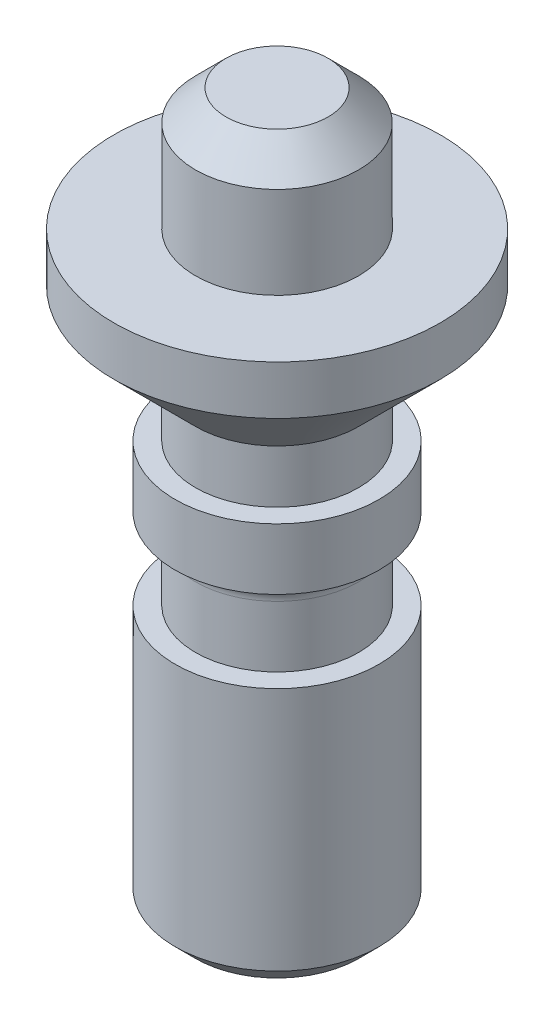
ISO-10303-21;
HEADER;
FILE_DESCRIPTION(('STEP AP214'),'2;1');
FILE_NAME('part.step','',(''),(''),'','','');
FILE_SCHEMA(('AUTOMOTIVE_DESIGN { 1 0 10303 214 1 1 1 1 }'));
ENDSEC;
DATA;
#1=APPLICATION_CONTEXT('core data for automotive mechanical design processes');
#2=APPLICATION_PROTOCOL_DEFINITION('international standard','automotive_design',2000,#1);
#3=PRODUCT_CONTEXT('',#1,'mechanical');
#4=PRODUCT('Part','Part','',(#3));
#5=PRODUCT_RELATED_PRODUCT_CATEGORY('part','',(#4));
#6=PRODUCT_DEFINITION_FORMATION('','',#4);
#7=PRODUCT_DEFINITION_CONTEXT('part definition',#1,'design');
#8=PRODUCT_DEFINITION('design','',#6,#7);
#9=PRODUCT_DEFINITION_SHAPE('','',#8);
#10=(LENGTH_UNIT() NAMED_UNIT(*) SI_UNIT(.MILLI.,.METRE.));
#11=(NAMED_UNIT(*) PLANE_ANGLE_UNIT() SI_UNIT($,.RADIAN.));
#12=(NAMED_UNIT(*) SI_UNIT($,.STERADIAN.) SOLID_ANGLE_UNIT());
#13=UNCERTAINTY_MEASURE_WITH_UNIT(LENGTH_MEASURE(1.E-05),#10,'distance_accuracy_value','');
#14=(GEOMETRIC_REPRESENTATION_CONTEXT(3) GLOBAL_UNCERTAINTY_ASSIGNED_CONTEXT((#13)) GLOBAL_UNIT_ASSIGNED_CONTEXT((#10,
#11,#12)) REPRESENTATION_CONTEXT('',''));
#15=CARTESIAN_POINT('',(0.,0.,0.));
#16=DIRECTION('',(0.,0.,1.));
#17=DIRECTION('',(1.,0.,0.));
#18=AXIS2_PLACEMENT_3D('',#15,#16,#17);
#19=CARTESIAN_POINT('',(0.,8.5,0.));
#20=DIRECTION('',(0.,-1.,0.));
#21=DIRECTION('',(1.,0.,0.));
#22=AXIS2_PLACEMENT_3D('',#19,#20,#21);
#23=CYLINDRICAL_SURFACE('',#22,1.5);
#24=CARTESIAN_POINT('',(0.,0.,0.));
#25=DIRECTION('',(0.,-1.,0.));
#26=DIRECTION('',(1.,0.,0.));
#27=AXIS2_PLACEMENT_3D('',#24,#25,#26);
#28=CIRCLE('',#27,1.5);
#29=CARTESIAN_POINT('',(-0.5,0.,1.4142135623731));
#30=VERTEX_POINT('',#29);
#31=CARTESIAN_POINT('',(-1.41421356237309,0.,0.500000000000015));
#32=VERTEX_POINT('',#31);
#33=EDGE_CURVE('E66',#30,#32,#28,.T.);
#34=ORIENTED_EDGE('',*,*,#33,.T.);
#35=DIRECTION('',(0.,-1.,0.));
#36=VECTOR('',#35,1.);
#37=CARTESIAN_POINT('',(-1.41421356237312,8.49999999999999,0.500000000000015));
#38=LINE('',#37,#36);
#39=CARTESIAN_POINT('',(-1.41421356237312,8.49999999999999,0.500000000000015));
#40=VERTEX_POINT('',#39);
#41=EDGE_CURVE('E194',#40,#32,#38,.T.);
#42=ORIENTED_EDGE('',*,*,#41,.F.);
#43=CARTESIAN_POINT('',(0.,8.5,0.));
#44=DIRECTION('',(0.,-1.,0.));
#45=DIRECTION('',(1.,0.,0.));
#46=AXIS2_PLACEMENT_3D('',#43,#44,#45);
#47=CIRCLE('',#46,1.5);
#48=CARTESIAN_POINT('',(-0.50000000000003,8.5,1.4142135623731));
#49=VERTEX_POINT('',#48);
#50=EDGE_CURVE('E313',#49,#40,#47,.T.);
#51=ORIENTED_EDGE('',*,*,#50,.F.);
#52=DIRECTION('',(0.,-1.,0.));
#53=VECTOR('',#52,1.);
#54=CARTESIAN_POINT('',(-0.50000000000003,8.5,1.4142135623731));
#55=LINE('',#54,#53);
#56=EDGE_CURVE('E289',#49,#30,#55,.T.);
#57=ORIENTED_EDGE('',*,*,#56,.T.);
#58=EDGE_LOOP('',(#34,#42,#51,#57));
#59=FACE_BOUND('',#58,.T.);
#60=ADVANCED_FACE('F41',(#59),#23,.F.);
#61=CARTESIAN_POINT('',(-1.41421356237313,8.49999999999999,-0.499999999999985));
#62=VERTEX_POINT('',#61);
#63=CARTESIAN_POINT('',(-0.500000000000029,8.5,-1.4142135623731));
#64=VERTEX_POINT('',#63);
#65=EDGE_CURVE('E317',#62,#64,#47,.T.);
#66=ORIENTED_EDGE('',*,*,#65,.F.);
#67=DIRECTION('',(0.,-1.,0.));
#68=VECTOR('',#67,1.);
#69=CARTESIAN_POINT('',(-1.41421356237313,8.49999999999999,-0.499999999999985));
#70=LINE('',#69,#68);
#71=CARTESIAN_POINT('',(-1.4142135623731,0.,-0.499999999999985));
#72=VERTEX_POINT('',#71);
#73=EDGE_CURVE('E58',#62,#72,#70,.T.);
#74=ORIENTED_EDGE('',*,*,#73,.T.);
#75=CARTESIAN_POINT('',(-0.5,0.,-1.4142135623731));
#76=VERTEX_POINT('',#75);
#77=EDGE_CURVE('E321',#72,#76,#28,.T.);
#78=ORIENTED_EDGE('',*,*,#77,.T.);
#79=DIRECTION('',(0.,-1.,0.));
#80=VECTOR('',#79,1.);
#81=CARTESIAN_POINT('',(-0.500000000000029,8.5,-1.4142135623731));
#82=LINE('',#81,#80);
#83=EDGE_CURVE('E226',#64,#76,#82,.T.);
#84=ORIENTED_EDGE('',*,*,#83,.F.);
#85=EDGE_LOOP('',(#66,#74,#78,#84));
#86=FACE_BOUND('',#85,.T.);
#87=ADVANCED_FACE('F390',(#86),#23,.F.);
#88=CARTESIAN_POINT('',(0.499999999999971,8.5,-1.4142135623731));
#89=VERTEX_POINT('',#88);
#90=CARTESIAN_POINT('',(1.41421356237306,8.50000000000001,-0.500000000000005));
#91=VERTEX_POINT('',#90);
#92=EDGE_CURVE('E667',#89,#91,#47,.T.);
#93=ORIENTED_EDGE('',*,*,#92,.F.);
#94=DIRECTION('',(0.,-1.,0.));
#95=VECTOR('',#94,1.);
#96=CARTESIAN_POINT('',(0.499999999999971,8.5,-1.4142135623731));
#97=LINE('',#96,#95);
#98=CARTESIAN_POINT('',(0.5,0.,-1.4142135623731));
#99=VERTEX_POINT('',#98);
#100=EDGE_CURVE('E215',#89,#99,#97,.T.);
#101=ORIENTED_EDGE('',*,*,#100,.T.);
#102=CARTESIAN_POINT('',(1.41421356237309,0.,-0.500000000000005));
#103=VERTEX_POINT('',#102);
#104=EDGE_CURVE('E651',#99,#103,#28,.T.);
#105=ORIENTED_EDGE('',*,*,#104,.T.);
#106=DIRECTION('',(0.,-1.,0.));
#107=VECTOR('',#106,1.);
#108=CARTESIAN_POINT('',(1.41421356237306,8.50000000000001,-0.500000000000005));
#109=LINE('',#108,#107);
#110=EDGE_CURVE('E263',#91,#103,#109,.T.);
#111=ORIENTED_EDGE('',*,*,#110,.F.);
#112=EDGE_LOOP('',(#93,#101,#105,#111));
#113=FACE_BOUND('',#112,.T.);
#114=ADVANCED_FACE('F385',(#113),#23,.F.);
#115=CARTESIAN_POINT('',(0.,0.,0.));
#116=DIRECTION('',(0.,-1.,0.));
#117=DIRECTION('',(1.,0.,0.));
#118=AXIS2_PLACEMENT_3D('',#115,#116,#117);
#119=PLANE('',#118);
#120=ORIENTED_EDGE('',*,*,#33,.F.);
#121=DIRECTION('',(0.,0.,-1.));
#122=VECTOR('',#121,1.);
#123=CARTESIAN_POINT('',(-0.5,0.,1.4142135623731));
#124=LINE('',#123,#122);
#125=CARTESIAN_POINT('',(-0.5,0.,1.14564392373896));
#126=VERTEX_POINT('',#125);
#127=EDGE_CURVE('E267',#30,#126,#124,.T.);
#128=ORIENTED_EDGE('',*,*,#127,.T.);
#129=CARTESIAN_POINT('',(0.,0.,0.));
#130=DIRECTION('',(0.,1.,0.));
#131=DIRECTION('',(1.,0.,0.));
#132=AXIS2_PLACEMENT_3D('',#129,#130,#131);
#133=CIRCLE('',#132,1.25);
#134=CARTESIAN_POINT('',(0.5,0.,1.14564392373896));
#135=VERTEX_POINT('',#134);
#136=EDGE_CURVE('E293',#126,#135,#133,.T.);
#137=ORIENTED_EDGE('',*,*,#136,.T.);
#138=DIRECTION('',(0.,0.,1.));
#139=VECTOR('',#138,1.);
#140=CARTESIAN_POINT('',(0.5,0.,1.4142135623731));
#141=LINE('',#140,#139);
#142=CARTESIAN_POINT('',(0.5,0.,1.4142135623731));
#143=VERTEX_POINT('',#142);
#144=EDGE_CURVE('E281',#135,#143,#141,.T.);
#145=ORIENTED_EDGE('',*,*,#144,.T.);
#146=CARTESIAN_POINT('',(1.4142135623731,0.,0.499999999999995));
#147=VERTEX_POINT('',#146);
#148=EDGE_CURVE('E304',#147,#143,#28,.T.);
#149=ORIENTED_EDGE('',*,*,#148,.F.);
#150=DIRECTION('',(-1.,0.,0.));
#151=VECTOR('',#150,1.);
#152=CARTESIAN_POINT('',(1.4142135623731,0.,0.499999999999995));
#153=LINE('',#152,#151);
#154=CARTESIAN_POINT('',(1.14564392373896,0.,0.499999999999996));
#155=VERTEX_POINT('',#154);
#156=EDGE_CURVE('E230',#147,#155,#153,.T.);
#157=ORIENTED_EDGE('',*,*,#156,.T.);
#158=CARTESIAN_POINT('',(0.,0.,0.));
#159=DIRECTION('',(0.,1.,0.));
#160=DIRECTION('',(0.,0.,-1.));
#161=AXIS2_PLACEMENT_3D('',#158,#159,#160);
#162=CIRCLE('',#161,1.25);
#163=CARTESIAN_POINT('',(1.14564392373896,0.,-0.500000000000004));
#164=VERTEX_POINT('',#163);
#165=EDGE_CURVE('E256',#155,#164,#162,.T.);
#166=ORIENTED_EDGE('',*,*,#165,.T.);
#167=DIRECTION('',(1.,0.,0.));
#168=VECTOR('',#167,1.);
#169=CARTESIAN_POINT('',(1.41421356237309,0.,-0.500000000000005));
#170=LINE('',#169,#168);
#171=EDGE_CURVE('E244',#164,#103,#170,.T.);
#172=ORIENTED_EDGE('',*,*,#171,.T.);
#173=ORIENTED_EDGE('',*,*,#104,.F.);
#174=DIRECTION('',(0.,0.,1.));
#175=VECTOR('',#174,1.);
#176=CARTESIAN_POINT('',(0.5,0.,-1.4142135623731));
#177=LINE('',#176,#175);
#178=CARTESIAN_POINT('',(0.5,0.,-1.14564392373896));
#179=VERTEX_POINT('',#178);
#180=EDGE_CURVE('E197',#99,#179,#177,.T.);
#181=ORIENTED_EDGE('',*,*,#180,.T.);
#182=CARTESIAN_POINT('',(0.,0.,0.));
#183=DIRECTION('',(0.,1.,0.));
#184=DIRECTION('',(-1.,0.,0.));
#185=AXIS2_PLACEMENT_3D('',#182,#183,#184);
#186=CIRCLE('',#185,1.25);
#187=CARTESIAN_POINT('',(-0.5,0.,-1.14564392373896));
#188=VERTEX_POINT('',#187);
#189=EDGE_CURVE('E219',#179,#188,#186,.T.);
#190=ORIENTED_EDGE('',*,*,#189,.T.);
#191=DIRECTION('',(0.,0.,-1.));
#192=VECTOR('',#191,1.);
#193=CARTESIAN_POINT('',(-0.5,0.,-1.4142135623731));
#194=LINE('',#193,#192);
#195=EDGE_CURVE('E207',#188,#76,#194,.T.);
#196=ORIENTED_EDGE('',*,*,#195,.T.);
#197=ORIENTED_EDGE('',*,*,#77,.F.);
#198=DIRECTION('',(1.,0.,0.));
#199=VECTOR('',#198,1.);
#200=CARTESIAN_POINT('',(-1.4142135623731,0.,-0.499999999999985));
#201=LINE('',#200,#199);
#202=CARTESIAN_POINT('',(-1.14564392373897,0.,-0.499999999999988));
#203=VERTEX_POINT('',#202);
#204=EDGE_CURVE('E189',#72,#203,#201,.T.);
#205=ORIENTED_EDGE('',*,*,#204,.T.);
#206=CARTESIAN_POINT('',(0.,0.,0.));
#207=DIRECTION('',(0.,1.,0.));
#208=DIRECTION('',(0.,0.,1.));
#209=AXIS2_PLACEMENT_3D('',#206,#207,#208);
#210=CIRCLE('',#209,1.25);
#211=CARTESIAN_POINT('',(-1.14564392373895,0.,0.500000000000012));
#212=VERTEX_POINT('',#211);
#213=EDGE_CURVE('E172',#203,#212,#210,.T.);
#214=ORIENTED_EDGE('',*,*,#213,.T.);
#215=DIRECTION('',(-1.,0.,0.));
#216=VECTOR('',#215,1.);
#217=CARTESIAN_POINT('',(-1.41421356237309,0.,0.500000000000015));
#218=LINE('',#217,#216);
#219=EDGE_CURVE('E181',#212,#32,#218,.T.);
#220=ORIENTED_EDGE('',*,*,#219,.T.);
#221=EDGE_LOOP('',(#120,#128,#137,#145,#149,#157,#166,#172,#173,#181,#190,#196,#197,#205,#214,#220));
#222=FACE_BOUND('',#221,.T.);
#223=CARTESIAN_POINT('',(0.,0.,0.));
#224=DIRECTION('',(0.,-1.,0.));
#225=DIRECTION('',(1.,0.,0.));
#226=AXIS2_PLACEMENT_3D('',#223,#224,#225);
#227=CIRCLE('',#226,2.00000000000002);
#228=CARTESIAN_POINT('',(2.00000000000002,0.,0.));
#229=VERTEX_POINT('',#228);
#230=EDGE_CURVE('E361',#229,#229,#227,.T.);
#231=ORIENTED_EDGE('',*,*,#230,.T.);
#232=EDGE_LOOP('',(#231));
#233=FACE_BOUND('',#232,.T.);
#234=ADVANCED_FACE('F438',(#222,#233),#119,.T.);
#235=CARTESIAN_POINT('',(3.54757386764062E-13,-103.42030181462,0.));
#236=DIRECTION('',(0.,-1.,0.));
#237=DIRECTION('',(1.,0.,0.));
#238=AXIS2_PLACEMENT_3D('',#235,#236,#237);
#239=CYLINDRICAL_SURFACE('',#238,2.50000000000001);
#240=CARTESIAN_POINT('',(0.,0.499999999999987,0.));
#241=DIRECTION('',(0.,-1.,0.));
#242=DIRECTION('',(1.,0.,0.));
#243=AXIS2_PLACEMENT_3D('',#240,#241,#242);
#244=CIRCLE('',#243,2.50000000000001);
#245=CARTESIAN_POINT('',(2.50000000000001,0.499999999999995,0.));
#246=VERTEX_POINT('',#245);
#247=EDGE_CURVE('E365',#246,#246,#244,.F.);
#248=ORIENTED_EDGE('',*,*,#247,.T.);
#249=EDGE_LOOP('',(#248));
#250=FACE_BOUND('',#249,.T.);
#251=CARTESIAN_POINT('',(0.,6.49999999999999,0.));
#252=DIRECTION('',(0.,-1.,0.));
#253=DIRECTION('',(1.,0.,0.));
#254=AXIS2_PLACEMENT_3D('',#251,#252,#253);
#255=CIRCLE('',#254,2.50000000000002);
#256=CARTESIAN_POINT('',(2.5,6.5,0.));
#257=VERTEX_POINT('',#256);
#258=EDGE_CURVE('E353',#257,#257,#255,.T.);
#259=ORIENTED_EDGE('',*,*,#258,.T.);
#260=EDGE_LOOP('',(#259));
#261=FACE_BOUND('',#260,.T.);
#262=ADVANCED_FACE('F434',(#250,#261),#239,.T.);
#263=CARTESIAN_POINT('',(2.5,6.5,0.));
#264=DIRECTION('',(0.,1.,0.));
#265=DIRECTION('',(-1.,0.,0.));
#266=AXIS2_PLACEMENT_3D('',#263,#264,#265);
#267=PLANE('',#266);
#268=CARTESIAN_POINT('',(0.,6.50000000000001,0.));
#269=DIRECTION('',(0.,-1.,0.));
#270=DIRECTION('',(1.,0.,0.));
#271=AXIS2_PLACEMENT_3D('',#268,#269,#270);
#272=CIRCLE('',#271,2.00000000000002);
#273=CARTESIAN_POINT('',(2.,6.50000000000001,0.));
#274=VERTEX_POINT('',#273);
#275=EDGE_CURVE('E349',#274,#274,#272,.T.);
#276=ORIENTED_EDGE('',*,*,#275,.T.);
#277=EDGE_LOOP('',(#276));
#278=FACE_BOUND('',#277,.T.);
#279=ORIENTED_EDGE('',*,*,#258,.F.);
#280=EDGE_LOOP('',(#279));
#281=FACE_BOUND('',#280,.T.);
#282=ADVANCED_FACE('F430',(#278,#281),#267,.T.);
#283=CARTESIAN_POINT('',(3.54757386764062E-13,-103.42030181462,0.));
#284=DIRECTION('',(0.,-1.,0.));
#285=DIRECTION('',(1.,0.,0.));
#286=AXIS2_PLACEMENT_3D('',#283,#284,#285);
#287=CYLINDRICAL_SURFACE('',#286,2.00000000000003);
#288=CARTESIAN_POINT('',(0.,7.99999999999999,0.));
#289=DIRECTION('',(0.,-1.,0.));
#290=DIRECTION('',(1.,0.,0.));
#291=AXIS2_PLACEMENT_3D('',#288,#289,#290);
#292=CIRCLE('',#291,2.00000000000003);
#293=CARTESIAN_POINT('',(2.,8.,0.));
#294=VERTEX_POINT('',#293);
#295=EDGE_CURVE('E357',#294,#294,#292,.T.);
#296=ORIENTED_EDGE('',*,*,#295,.T.);
#297=EDGE_LOOP('',(#296));
#298=FACE_BOUND('',#297,.T.);
#299=ORIENTED_EDGE('',*,*,#275,.F.);
#300=EDGE_LOOP('',(#299));
#301=FACE_BOUND('',#300,.T.);
#302=ADVANCED_FACE('F426',(#298,#301),#287,.T.);
#303=CARTESIAN_POINT('',(3.54757386764062E-13,-103.42030181462,0.));
#304=DIRECTION('',(0.,-1.,0.));
#305=DIRECTION('',(1.,0.,0.));
#306=AXIS2_PLACEMENT_3D('',#303,#304,#305);
#307=CYLINDRICAL_SURFACE('',#306,2.50000000000003);
#308=CARTESIAN_POINT('',(0.,9.99999999999998,0.));
#309=DIRECTION('',(0.,-1.,0.));
#310=DIRECTION('',(1.,0.,0.));
#311=AXIS2_PLACEMENT_3D('',#308,#309,#310);
#312=CIRCLE('',#311,2.50000000000004);
#313=CARTESIAN_POINT('',(2.5,9.99999999999999,0.));
#314=VERTEX_POINT('',#313);
#315=EDGE_CURVE('E341',#314,#314,#312,.T.);
#316=ORIENTED_EDGE('',*,*,#315,.T.);
#317=EDGE_LOOP('',(#316));
#318=FACE_BOUND('',#317,.T.);
#319=CARTESIAN_POINT('',(0.,8.49999999999998,0.));
#320=DIRECTION('',(0.,-1.,0.));
#321=DIRECTION('',(1.,0.,0.));
#322=AXIS2_PLACEMENT_3D('',#319,#320,#321);
#323=CIRCLE('',#322,2.50000000000003);
#324=CARTESIAN_POINT('',(2.5,8.49999999999999,0.));
#325=VERTEX_POINT('',#324);
#326=EDGE_CURVE('E345',#325,#325,#323,.T.);
#327=ORIENTED_EDGE('',*,*,#326,.F.);
#328=EDGE_LOOP('',(#327));
#329=FACE_BOUND('',#328,.T.);
#330=ADVANCED_FACE('F422',(#318,#329),#307,.T.);
#331=CARTESIAN_POINT('',(2.5,10.,0.));
#332=DIRECTION('',(0.,1.,0.));
#333=DIRECTION('',(-1.,0.,0.));
#334=AXIS2_PLACEMENT_3D('',#331,#332,#333);
#335=PLANE('',#334);
#336=CARTESIAN_POINT('',(0.,9.99999999999999,0.));
#337=DIRECTION('',(0.,-1.,0.));
#338=DIRECTION('',(1.,0.,0.));
#339=AXIS2_PLACEMENT_3D('',#336,#337,#338);
#340=CIRCLE('',#339,2.00000000000004);
#341=CARTESIAN_POINT('',(2.,10.,0.));
#342=VERTEX_POINT('',#341);
#343=EDGE_CURVE('E337',#342,#342,#340,.T.);
#344=ORIENTED_EDGE('',*,*,#343,.T.);
#345=EDGE_LOOP('',(#344));
#346=FACE_BOUND('',#345,.T.);
#347=ORIENTED_EDGE('',*,*,#315,.F.);
#348=EDGE_LOOP('',(#347));
#349=FACE_BOUND('',#348,.T.);
#350=ADVANCED_FACE('F418',(#346,#349),#335,.T.);
#351=CARTESIAN_POINT('',(3.54757386764062E-13,-103.42030181462,0.));
#352=DIRECTION('',(0.,-1.,0.));
#353=DIRECTION('',(1.,0.,0.));
#354=AXIS2_PLACEMENT_3D('',#351,#352,#353);
#355=CYLINDRICAL_SURFACE('',#354,2.00000000000004);
#356=CARTESIAN_POINT('',(0.,11.3,0.));
#357=DIRECTION('',(0.,-1.,0.));
#358=DIRECTION('',(1.,0.,0.));
#359=AXIS2_PLACEMENT_3D('',#356,#357,#358);
#360=CIRCLE('',#359,2.00000000000004);
#361=CARTESIAN_POINT('',(2.,11.3,0.));
#362=VERTEX_POINT('',#361);
#363=EDGE_CURVE('E333',#362,#362,#360,.T.);
#364=ORIENTED_EDGE('',*,*,#363,.T.);
#365=EDGE_LOOP('',(#364));
#366=FACE_BOUND('',#365,.T.);
#367=ORIENTED_EDGE('',*,*,#343,.F.);
#368=EDGE_LOOP('',(#367));
#369=FACE_BOUND('',#368,.T.);
#370=ADVANCED_FACE('F414',(#366,#369),#355,.T.);
#371=CARTESIAN_POINT('',(0.,11.3,0.));
#372=DIRECTION('',(0.,1.,0.));
#373=DIRECTION('',(-1.,0.,0.));
#374=AXIS2_PLACEMENT_3D('',#371,#372,#373);
#375=CONICAL_SURFACE('',#374,2.00000000000004,0.785398163397453);
#376=CARTESIAN_POINT('',(0.,13.3000000000002,0.));
#377=DIRECTION('',(0.,-1.,0.));
#378=DIRECTION('',(1.,0.,0.));
#379=AXIS2_PLACEMENT_3D('',#376,#377,#378);
#380=CIRCLE('',#379,4.0000000000003);
#381=CARTESIAN_POINT('',(4.00000000000025,13.3000000000003,0.));
#382=VERTEX_POINT('',#381);
#383=EDGE_CURVE('E329',#382,#382,#380,.T.);
#384=ORIENTED_EDGE('',*,*,#383,.T.);
#385=EDGE_LOOP('',(#384));
#386=FACE_BOUND('',#385,.T.);
#387=ORIENTED_EDGE('',*,*,#363,.F.);
#388=EDGE_LOOP('',(#387));
#389=FACE_BOUND('',#388,.T.);
#390=ADVANCED_FACE('F410',(#386,#389),#375,.T.);
#391=CARTESIAN_POINT('',(3.54757386764062E-13,-103.42030181462,0.));
#392=DIRECTION('',(0.,-1.,0.));
#393=DIRECTION('',(1.,0.,0.));
#394=AXIS2_PLACEMENT_3D('',#391,#392,#393);
#395=CYLINDRICAL_SURFACE('',#394,4.00000000000016);
#396=CARTESIAN_POINT('',(0.,14.5,0.));
#397=DIRECTION('',(0.,-1.,0.));
#398=DIRECTION('',(1.,0.,0.));
#399=AXIS2_PLACEMENT_3D('',#396,#397,#398);
#400=CIRCLE('',#399,4.00000000000003);
#401=CARTESIAN_POINT('',(3.99999999999998,14.5,0.));
#402=VERTEX_POINT('',#401);
#403=EDGE_CURVE('E325',#402,#402,#400,.T.);
#404=ORIENTED_EDGE('',*,*,#403,.T.);
#405=EDGE_LOOP('',(#404));
#406=FACE_BOUND('',#405,.T.);
#407=ORIENTED_EDGE('',*,*,#383,.F.);
#408=EDGE_LOOP('',(#407));
#409=FACE_BOUND('',#408,.T.);
#410=ADVANCED_FACE('F406',(#406,#409),#395,.T.);
#411=CARTESIAN_POINT('',(3.99999999999998,14.5000000000001,0.));
#412=DIRECTION('',(0.,1.,0.));
#413=DIRECTION('',(-1.,0.,0.));
#414=AXIS2_PLACEMENT_3D('',#411,#412,#413);
#415=PLANE('',#414);
#416=CARTESIAN_POINT('',(0.,14.5000000000003,0.));
#417=DIRECTION('',(0.,-1.,0.));
#418=DIRECTION('',(1.,0.,0.));
#419=AXIS2_PLACEMENT_3D('',#416,#417,#418);
#420=CIRCLE('',#419,2.00000000000005);
#421=CARTESIAN_POINT('',(2.,14.5000000000003,0.));
#422=VERTEX_POINT('',#421);
#423=EDGE_CURVE('E316',#422,#422,#420,.T.);
#424=ORIENTED_EDGE('',*,*,#423,.T.);
#425=EDGE_LOOP('',(#424));
#426=FACE_BOUND('',#425,.T.);
#427=ORIENTED_EDGE('',*,*,#403,.F.);
#428=EDGE_LOOP('',(#427));
#429=FACE_BOUND('',#428,.T.);
#430=ADVANCED_FACE('F403',(#426,#429),#415,.T.);
#431=CARTESIAN_POINT('',(3.54757386764062E-13,-103.42030181462,0.));
#432=DIRECTION('',(0.,-1.,0.));
#433=DIRECTION('',(1.,0.,0.));
#434=AXIS2_PLACEMENT_3D('',#431,#432,#433);
#435=CYLINDRICAL_SURFACE('',#434,2.00000000000006);
#436=CARTESIAN_POINT('',(0.,16.7500000000003,0.));
#437=DIRECTION('',(0.,1.,0.));
#438=DIRECTION('',(-1.,0.,0.));
#439=AXIS2_PLACEMENT_3D('',#436,#437,#438);
#440=CIRCLE('',#439,2.00000000000006);
#441=CARTESIAN_POINT('',(-2.00000000000011,16.7500000000003,0.));
#442=VERTEX_POINT('',#441);
#443=EDGE_CURVE('E51',#442,#442,#440,.F.);
#444=ORIENTED_EDGE('',*,*,#443,.T.);
#445=EDGE_LOOP('',(#444));
#446=FACE_BOUND('',#445,.T.);
#447=ORIENTED_EDGE('',*,*,#423,.F.);
#448=EDGE_LOOP('',(#447));
#449=FACE_BOUND('',#448,.T.);
#450=ADVANCED_FACE('F372',(#446,#449),#435,.T.);
#451=CARTESIAN_POINT('',(2.,17.5000000000003,0.));
#452=DIRECTION('',(0.,1.,0.));
#453=DIRECTION('',(-1.,0.,0.));
#454=AXIS2_PLACEMENT_3D('',#451,#452,#453);
#455=PLANE('',#454);
#456=CARTESIAN_POINT('',(0.,17.5000000000003,0.));
#457=DIRECTION('',(0.,1.,0.));
#458=DIRECTION('',(-1.,0.,0.));
#459=AXIS2_PLACEMENT_3D('',#456,#457,#458);
#460=CIRCLE('',#459,1.25000000000009);
#461=CARTESIAN_POINT('',(-1.25000000000015,17.5000000000003,0.));
#462=VERTEX_POINT('',#461);
#463=EDGE_CURVE('E11',#462,#462,#460,.T.);
#464=ORIENTED_EDGE('',*,*,#463,.T.);
#465=EDGE_LOOP('',(#464));
#466=FACE_BOUND('',#465,.T.);
#467=ADVANCED_FACE('F397',(#466),#455,.T.);
#468=CARTESIAN_POINT('',(0.,7.99999999999999,0.));
#469=DIRECTION('',(0.,-1.,0.));
#470=DIRECTION('',(1.,0.,0.));
#471=AXIS2_PLACEMENT_3D('',#468,#469,#470);
#472=TOROIDAL_SURFACE('',#471,2.50000000000003,0.5);
#473=ORIENTED_EDGE('',*,*,#326,.T.);
#474=EDGE_LOOP('',(#473));
#475=FACE_BOUND('',#474,.T.);
#476=ORIENTED_EDGE('',*,*,#295,.F.);
#477=EDGE_LOOP('',(#476));
#478=FACE_BOUND('',#477,.T.);
#479=ADVANCED_FACE('F386',(#475,#478),#472,.F.);
#480=CARTESIAN_POINT('',(0.,0.,0.));
#481=DIRECTION('',(0.,1.,0.));
#482=DIRECTION('',(-1.,0.,0.));
#483=AXIS2_PLACEMENT_3D('',#480,#481,#482);
#484=CONICAL_SURFACE('',#483,2.00000000000002,0.785398163397453);
#485=ORIENTED_EDGE('',*,*,#247,.F.);
#486=EDGE_LOOP('',(#485));
#487=FACE_BOUND('',#486,.T.);
#488=ORIENTED_EDGE('',*,*,#230,.F.);
#489=EDGE_LOOP('',(#488));
#490=FACE_BOUND('',#489,.T.);
#491=ADVANCED_FACE('F377',(#487,#490),#484,.T.);
#492=CARTESIAN_POINT('',(0.,16.7500000000003,0.));
#493=DIRECTION('',(0.,-1.,0.));
#494=DIRECTION('',(1.,0.,0.));
#495=AXIS2_PLACEMENT_3D('',#492,#493,#494);
#496=CONICAL_SURFACE('',#495,2.00000000000006,0.785398163397451);
#497=ORIENTED_EDGE('',*,*,#463,.F.);
#498=EDGE_LOOP('',(#497));
#499=FACE_BOUND('',#498,.T.);
#500=ORIENTED_EDGE('',*,*,#443,.F.);
#501=EDGE_LOOP('',(#500));
#502=FACE_BOUND('',#501,.T.);
#503=ADVANCED_FACE('F44',(#499,#502),#496,.T.);
#504=CARTESIAN_POINT('',(1.41421356237307,8.50000000000001,0.499999999999995));
#505=VERTEX_POINT('',#504);
#506=CARTESIAN_POINT('',(0.499999999999971,8.5,1.4142135623731));
#507=VERTEX_POINT('',#506);
#508=EDGE_CURVE('E318',#505,#507,#47,.T.);
#509=ORIENTED_EDGE('',*,*,#508,.F.);
#510=DIRECTION('',(0.,-1.,0.));
#511=VECTOR('',#510,1.);
#512=CARTESIAN_POINT('',(1.41421356237307,8.50000000000001,0.499999999999995));
#513=LINE('',#512,#511);
#514=EDGE_CURVE('E252',#505,#147,#513,.T.);
#515=ORIENTED_EDGE('',*,*,#514,.T.);
#516=ORIENTED_EDGE('',*,*,#148,.T.);
#517=DIRECTION('',(0.,-1.,0.));
#518=VECTOR('',#517,1.);
#519=CARTESIAN_POINT('',(0.499999999999971,8.5,1.4142135623731));
#520=LINE('',#519,#518);
#521=EDGE_CURVE('E300',#507,#143,#520,.T.);
#522=ORIENTED_EDGE('',*,*,#521,.F.);
#523=EDGE_LOOP('',(#509,#515,#516,#522));
#524=FACE_BOUND('',#523,.T.);
#525=ADVANCED_FACE('F376',(#524),#23,.F.);
#526=CARTESIAN_POINT('',(0.,8.5,0.));
#527=DIRECTION('',(0.,-1.,0.));
#528=DIRECTION('',(1.,0.,0.));
#529=AXIS2_PLACEMENT_3D('',#526,#527,#528);
#530=PLANE('',#529);
#531=DIRECTION('',(-1.,0.,0.));
#532=VECTOR('',#531,1.);
#533=CARTESIAN_POINT('',(-1.41421356237312,8.49999999999999,0.500000000000015));
#534=LINE('',#533,#532);
#535=CARTESIAN_POINT('',(-1.14564392373898,8.5,0.500000000000012));
#536=VERTEX_POINT('',#535);
#537=EDGE_CURVE('E163',#536,#40,#534,.T.);
#538=ORIENTED_EDGE('',*,*,#537,.F.);
#539=CARTESIAN_POINT('',(0.,8.5,0.));
#540=DIRECTION('',(0.,1.,0.));
#541=DIRECTION('',(0.,0.,1.));
#542=AXIS2_PLACEMENT_3D('',#539,#540,#541);
#543=CIRCLE('',#542,1.25);
#544=CARTESIAN_POINT('',(-1.14564392373899,8.5,-0.499999999999988));
#545=VERTEX_POINT('',#544);
#546=EDGE_CURVE('E156',#545,#536,#543,.T.);
#547=ORIENTED_EDGE('',*,*,#546,.F.);
#548=DIRECTION('',(1.,0.,0.));
#549=VECTOR('',#548,1.);
#550=CARTESIAN_POINT('',(-1.41421356237313,8.49999999999999,-0.499999999999985));
#551=LINE('',#550,#549);
#552=EDGE_CURVE('E160',#62,#545,#551,.T.);
#553=ORIENTED_EDGE('',*,*,#552,.F.);
#554=ORIENTED_EDGE('',*,*,#65,.T.);
#555=DIRECTION('',(0.,0.,-1.));
#556=VECTOR('',#555,1.);
#557=CARTESIAN_POINT('',(-0.500000000000029,8.5,-1.4142135623731));
#558=LINE('',#557,#556);
#559=CARTESIAN_POINT('',(-0.500000000000029,8.5,-1.14564392373896));
#560=VERTEX_POINT('',#559);
#561=EDGE_CURVE('E211',#560,#64,#558,.T.);
#562=ORIENTED_EDGE('',*,*,#561,.F.);
#563=CARTESIAN_POINT('',(0.,8.5,0.));
#564=DIRECTION('',(0.,1.,0.));
#565=DIRECTION('',(-1.,0.,0.));
#566=AXIS2_PLACEMENT_3D('',#563,#564,#565);
#567=CIRCLE('',#566,1.25);
#568=CARTESIAN_POINT('',(0.499999999999971,8.5,-1.14564392373896));
#569=VERTEX_POINT('',#568);
#570=EDGE_CURVE('E206',#569,#560,#567,.T.);
#571=ORIENTED_EDGE('',*,*,#570,.F.);
#572=DIRECTION('',(0.,0.,1.));
#573=VECTOR('',#572,1.);
#574=CARTESIAN_POINT('',(0.499999999999971,8.5,-1.4142135623731));
#575=LINE('',#574,#573);
#576=EDGE_CURVE('E202',#89,#569,#575,.T.);
#577=ORIENTED_EDGE('',*,*,#576,.F.);
#578=ORIENTED_EDGE('',*,*,#92,.T.);
#579=DIRECTION('',(1.,0.,0.));
#580=VECTOR('',#579,1.);
#581=CARTESIAN_POINT('',(1.41421356237306,8.50000000000001,-0.500000000000005));
#582=LINE('',#581,#580);
#583=CARTESIAN_POINT('',(1.14564392373893,8.5,-0.500000000000004));
#584=VERTEX_POINT('',#583);
#585=EDGE_CURVE('E248',#584,#91,#582,.T.);
#586=ORIENTED_EDGE('',*,*,#585,.F.);
#587=CARTESIAN_POINT('',(0.,8.5,0.));
#588=DIRECTION('',(0.,1.,0.));
#589=DIRECTION('',(0.,0.,-1.));
#590=AXIS2_PLACEMENT_3D('',#587,#588,#589);
#591=CIRCLE('',#590,1.25);
#592=CARTESIAN_POINT('',(1.14564392373893,8.5,0.499999999999996));
#593=VERTEX_POINT('',#592);
#594=EDGE_CURVE('E243',#593,#584,#591,.T.);
#595=ORIENTED_EDGE('',*,*,#594,.F.);
#596=DIRECTION('',(-1.,0.,0.));
#597=VECTOR('',#596,1.);
#598=CARTESIAN_POINT('',(1.41421356237307,8.50000000000001,0.499999999999995));
#599=LINE('',#598,#597);
#600=EDGE_CURVE('E239',#505,#593,#599,.T.);
#601=ORIENTED_EDGE('',*,*,#600,.F.);
#602=ORIENTED_EDGE('',*,*,#508,.T.);
#603=DIRECTION('',(0.,0.,1.));
#604=VECTOR('',#603,1.);
#605=CARTESIAN_POINT('',(0.499999999999971,8.5,1.4142135623731));
#606=LINE('',#605,#604);
#607=CARTESIAN_POINT('',(0.499999999999971,8.5,1.14564392373896));
#608=VERTEX_POINT('',#607);
#609=EDGE_CURVE('E285',#608,#507,#606,.T.);
#610=ORIENTED_EDGE('',*,*,#609,.F.);
#611=CARTESIAN_POINT('',(0.,8.5,0.));
#612=DIRECTION('',(0.,1.,0.));
#613=DIRECTION('',(1.,0.,0.));
#614=AXIS2_PLACEMENT_3D('',#611,#612,#613);
#615=CIRCLE('',#614,1.25);
#616=CARTESIAN_POINT('',(-0.500000000000029,8.5,1.14564392373896));
#617=VERTEX_POINT('',#616);
#618=EDGE_CURVE('E280',#617,#608,#615,.T.);
#619=ORIENTED_EDGE('',*,*,#618,.F.);
#620=DIRECTION('',(0.,0.,-1.));
#621=VECTOR('',#620,1.);
#622=CARTESIAN_POINT('',(-0.50000000000003,8.5,1.4142135623731));
#623=LINE('',#622,#621);
#624=EDGE_CURVE('E276',#49,#617,#623,.T.);
#625=ORIENTED_EDGE('',*,*,#624,.F.);
#626=ORIENTED_EDGE('',*,*,#50,.T.);
#627=EDGE_LOOP('',(#538,#547,#553,#554,#562,#571,#577,#578,#586,#595,#601,#602,#610,#619,#625,#626));
#628=FACE_BOUND('',#627,.T.);
#629=ADVANCED_FACE('F158',(#628),#530,.T.);
#630=CARTESIAN_POINT('',(0.499999999999971,8.5,1.4142135623731));
#631=DIRECTION('',(1.,0.,0.));
#632=DIRECTION('',(0.,1.,0.));
#633=AXIS2_PLACEMENT_3D('',#630,#631,#632);
#634=PLANE('',#633);
#635=ORIENTED_EDGE('',*,*,#144,.F.);
#636=DIRECTION('',(0.,-1.,0.));
#637=VECTOR('',#636,1.);
#638=CARTESIAN_POINT('',(0.499999999999971,8.5,1.14564392373896));
#639=LINE('',#638,#637);
#640=EDGE_CURVE('E305',#608,#135,#639,.T.);
#641=ORIENTED_EDGE('',*,*,#640,.F.);
#642=ORIENTED_EDGE('',*,*,#609,.T.);
#643=ORIENTED_EDGE('',*,*,#521,.T.);
#644=EDGE_LOOP('',(#635,#641,#642,#643));
#645=FACE_BOUND('',#644,.T.);
#646=ADVANCED_FACE('F492',(#645),#634,.T.);
#647=CARTESIAN_POINT('',(0.,8.5,0.));
#648=DIRECTION('',(0.,-1.,0.));
#649=DIRECTION('',(1.,0.,0.));
#650=AXIS2_PLACEMENT_3D('',#647,#648,#649);
#651=CYLINDRICAL_SURFACE('',#650,1.25);
#652=ORIENTED_EDGE('',*,*,#136,.F.);
#653=DIRECTION('',(0.,-1.,0.));
#654=VECTOR('',#653,1.);
#655=CARTESIAN_POINT('',(-0.500000000000029,8.5,1.14564392373896));
#656=LINE('',#655,#654);
#657=EDGE_CURVE('E308',#617,#126,#656,.T.);
#658=ORIENTED_EDGE('',*,*,#657,.F.);
#659=ORIENTED_EDGE('',*,*,#618,.T.);
#660=ORIENTED_EDGE('',*,*,#640,.T.);
#661=EDGE_LOOP('',(#652,#658,#659,#660));
#662=FACE_BOUND('',#661,.T.);
#663=ADVANCED_FACE('F497',(#662),#651,.F.);
#664=CARTESIAN_POINT('',(-0.50000000000003,8.5,1.4142135623731));
#665=DIRECTION('',(-1.,0.,0.));
#666=DIRECTION('',(0.,-1.,0.));
#667=AXIS2_PLACEMENT_3D('',#664,#665,#666);
#668=PLANE('',#667);
#669=ORIENTED_EDGE('',*,*,#127,.F.);
#670=ORIENTED_EDGE('',*,*,#56,.F.);
#671=ORIENTED_EDGE('',*,*,#624,.T.);
#672=ORIENTED_EDGE('',*,*,#657,.T.);
#673=EDGE_LOOP('',(#669,#670,#671,#672));
#674=FACE_BOUND('',#673,.T.);
#675=ADVANCED_FACE('F509',(#674),#668,.T.);
#676=CARTESIAN_POINT('',(1.41421356237306,8.50000000000001,-0.500000000000005));
#677=DIRECTION('',(0.,0.,-1.));
#678=DIRECTION('',(-1.,0.,0.));
#679=AXIS2_PLACEMENT_3D('',#676,#677,#678);
#680=PLANE('',#679);
#681=ORIENTED_EDGE('',*,*,#171,.F.);
#682=DIRECTION('',(0.,-1.,0.));
#683=VECTOR('',#682,1.);
#684=CARTESIAN_POINT('',(1.14564392373893,8.5,-0.500000000000004));
#685=LINE('',#684,#683);
#686=EDGE_CURVE('E268',#584,#164,#685,.T.);
#687=ORIENTED_EDGE('',*,*,#686,.F.);
#688=ORIENTED_EDGE('',*,*,#585,.T.);
#689=ORIENTED_EDGE('',*,*,#110,.T.);
#690=EDGE_LOOP('',(#681,#687,#688,#689));
#691=FACE_BOUND('',#690,.T.);
#692=ADVANCED_FACE('F518',(#691),#680,.T.);
#693=CARTESIAN_POINT('',(0.,8.5,0.));
#694=DIRECTION('',(0.,-1.,0.));
#695=DIRECTION('',(1.,0.,0.));
#696=AXIS2_PLACEMENT_3D('',#693,#694,#695);
#697=CYLINDRICAL_SURFACE('',#696,1.25);
#698=ORIENTED_EDGE('',*,*,#165,.F.);
#699=DIRECTION('',(0.,-1.,0.));
#700=VECTOR('',#699,1.);
#701=CARTESIAN_POINT('',(1.14564392373893,8.5,0.499999999999996));
#702=LINE('',#701,#700);
#703=EDGE_CURVE('E271',#593,#155,#702,.T.);
#704=ORIENTED_EDGE('',*,*,#703,.F.);
#705=ORIENTED_EDGE('',*,*,#594,.T.);
#706=ORIENTED_EDGE('',*,*,#686,.T.);
#707=EDGE_LOOP('',(#698,#704,#705,#706));
#708=FACE_BOUND('',#707,.T.);
#709=ADVANCED_FACE('F565',(#708),#697,.F.);
#710=CARTESIAN_POINT('',(1.41421356237307,8.50000000000001,0.499999999999995));
#711=DIRECTION('',(0.,0.,1.));
#712=DIRECTION('',(1.,0.,0.));
#713=AXIS2_PLACEMENT_3D('',#710,#711,#712);
#714=PLANE('',#713);
#715=ORIENTED_EDGE('',*,*,#156,.F.);
#716=ORIENTED_EDGE('',*,*,#514,.F.);
#717=ORIENTED_EDGE('',*,*,#600,.T.);
#718=ORIENTED_EDGE('',*,*,#703,.T.);
#719=EDGE_LOOP('',(#715,#716,#717,#718));
#720=FACE_BOUND('',#719,.T.);
#721=ADVANCED_FACE('F575',(#720),#714,.T.);
#722=CARTESIAN_POINT('',(-0.500000000000029,8.5,-1.4142135623731));
#723=DIRECTION('',(-1.,0.,0.));
#724=DIRECTION('',(0.,-1.,0.));
#725=AXIS2_PLACEMENT_3D('',#722,#723,#724);
#726=PLANE('',#725);
#727=ORIENTED_EDGE('',*,*,#195,.F.);
#728=DIRECTION('',(0.,-1.,0.));
#729=VECTOR('',#728,1.);
#730=CARTESIAN_POINT('',(-0.500000000000029,8.5,-1.14564392373896));
#731=LINE('',#730,#729);
#732=EDGE_CURVE('E231',#560,#188,#731,.T.);
#733=ORIENTED_EDGE('',*,*,#732,.F.);
#734=ORIENTED_EDGE('',*,*,#561,.T.);
#735=ORIENTED_EDGE('',*,*,#83,.T.);
#736=EDGE_LOOP('',(#727,#733,#734,#735));
#737=FACE_BOUND('',#736,.T.);
#738=ADVANCED_FACE('F585',(#737),#726,.T.);
#739=CARTESIAN_POINT('',(0.,8.5,0.));
#740=DIRECTION('',(0.,-1.,0.));
#741=DIRECTION('',(1.,0.,0.));
#742=AXIS2_PLACEMENT_3D('',#739,#740,#741);
#743=CYLINDRICAL_SURFACE('',#742,1.25);
#744=ORIENTED_EDGE('',*,*,#189,.F.);
#745=DIRECTION('',(0.,-1.,0.));
#746=VECTOR('',#745,1.);
#747=CARTESIAN_POINT('',(0.499999999999971,8.5,-1.14564392373896));
#748=LINE('',#747,#746);
#749=EDGE_CURVE('E234',#569,#179,#748,.T.);
#750=ORIENTED_EDGE('',*,*,#749,.F.);
#751=ORIENTED_EDGE('',*,*,#570,.T.);
#752=ORIENTED_EDGE('',*,*,#732,.T.);
#753=EDGE_LOOP('',(#744,#750,#751,#752));
#754=FACE_BOUND('',#753,.T.);
#755=ADVANCED_FACE('F595',(#754),#743,.F.);
#756=CARTESIAN_POINT('',(0.499999999999971,8.5,-1.4142135623731));
#757=DIRECTION('',(1.,0.,0.));
#758=DIRECTION('',(0.,1.,0.));
#759=AXIS2_PLACEMENT_3D('',#756,#757,#758);
#760=PLANE('',#759);
#761=ORIENTED_EDGE('',*,*,#180,.F.);
#762=ORIENTED_EDGE('',*,*,#100,.F.);
#763=ORIENTED_EDGE('',*,*,#576,.T.);
#764=ORIENTED_EDGE('',*,*,#749,.T.);
#765=EDGE_LOOP('',(#761,#762,#763,#764));
#766=FACE_BOUND('',#765,.T.);
#767=ADVANCED_FACE('F605',(#766),#760,.T.);
#768=CARTESIAN_POINT('',(-1.41421356237312,8.49999999999999,0.500000000000015));
#769=DIRECTION('',(0.,0.,1.));
#770=DIRECTION('',(1.,0.,0.));
#771=AXIS2_PLACEMENT_3D('',#768,#769,#770);
#772=PLANE('',#771);
#773=ORIENTED_EDGE('',*,*,#219,.F.);
#774=DIRECTION('',(0.,-1.,0.));
#775=VECTOR('',#774,1.);
#776=CARTESIAN_POINT('',(-1.14564392373898,8.5,0.500000000000012));
#777=LINE('',#776,#775);
#778=EDGE_CURVE('E177',#536,#212,#777,.T.);
#779=ORIENTED_EDGE('',*,*,#778,.F.);
#780=ORIENTED_EDGE('',*,*,#537,.T.);
#781=ORIENTED_EDGE('',*,*,#41,.T.);
#782=EDGE_LOOP('',(#773,#779,#780,#781));
#783=FACE_BOUND('',#782,.T.);
#784=ADVANCED_FACE('F615',(#783),#772,.T.);
#785=CARTESIAN_POINT('',(0.,8.5,0.));
#786=DIRECTION('',(0.,-1.,0.));
#787=DIRECTION('',(1.,0.,0.));
#788=AXIS2_PLACEMENT_3D('',#785,#786,#787);
#789=CYLINDRICAL_SURFACE('',#788,1.25);
#790=ORIENTED_EDGE('',*,*,#213,.F.);
#791=DIRECTION('',(0.,-1.,0.));
#792=VECTOR('',#791,1.);
#793=CARTESIAN_POINT('',(-1.14564392373899,8.5,-0.499999999999988));
#794=LINE('',#793,#792);
#795=EDGE_CURVE('E169',#545,#203,#794,.T.);
#796=ORIENTED_EDGE('',*,*,#795,.F.);
#797=ORIENTED_EDGE('',*,*,#546,.T.);
#798=ORIENTED_EDGE('',*,*,#778,.T.);
#799=EDGE_LOOP('',(#790,#796,#797,#798));
#800=FACE_BOUND('',#799,.T.);
#801=ADVANCED_FACE('F170',(#800),#789,.F.);
#802=CARTESIAN_POINT('',(-1.41421356237313,8.49999999999999,-0.499999999999985));
#803=DIRECTION('',(0.,0.,-1.));
#804=DIRECTION('',(-1.,0.,0.));
#805=AXIS2_PLACEMENT_3D('',#802,#803,#804);
#806=PLANE('',#805);
#807=ORIENTED_EDGE('',*,*,#204,.F.);
#808=ORIENTED_EDGE('',*,*,#73,.F.);
#809=ORIENTED_EDGE('',*,*,#552,.T.);
#810=ORIENTED_EDGE('',*,*,#795,.T.);
#811=EDGE_LOOP('',(#807,#808,#809,#810));
#812=FACE_BOUND('',#811,.T.);
#813=ADVANCED_FACE('F179',(#812),#806,.T.);
#814=CLOSED_SHELL('',(#60,#87,#114,#234,#262,#282,#302,#330,#350,#370,#390,#410,#430,#450,#467,
#479,#491,#503,#525,#629,#646,#663,#675,#692,#709,#721,#738,#755,#767,#784,#801,#813));
#815=MANIFOLD_SOLID_BREP('B2',#814);
#816=ADVANCED_BREP_SHAPE_REPRESENTATION('',(#18,#815),#14);
#817=SHAPE_DEFINITION_REPRESENTATION(#9,#816);
ENDSEC;
END-ISO-10303-21;
